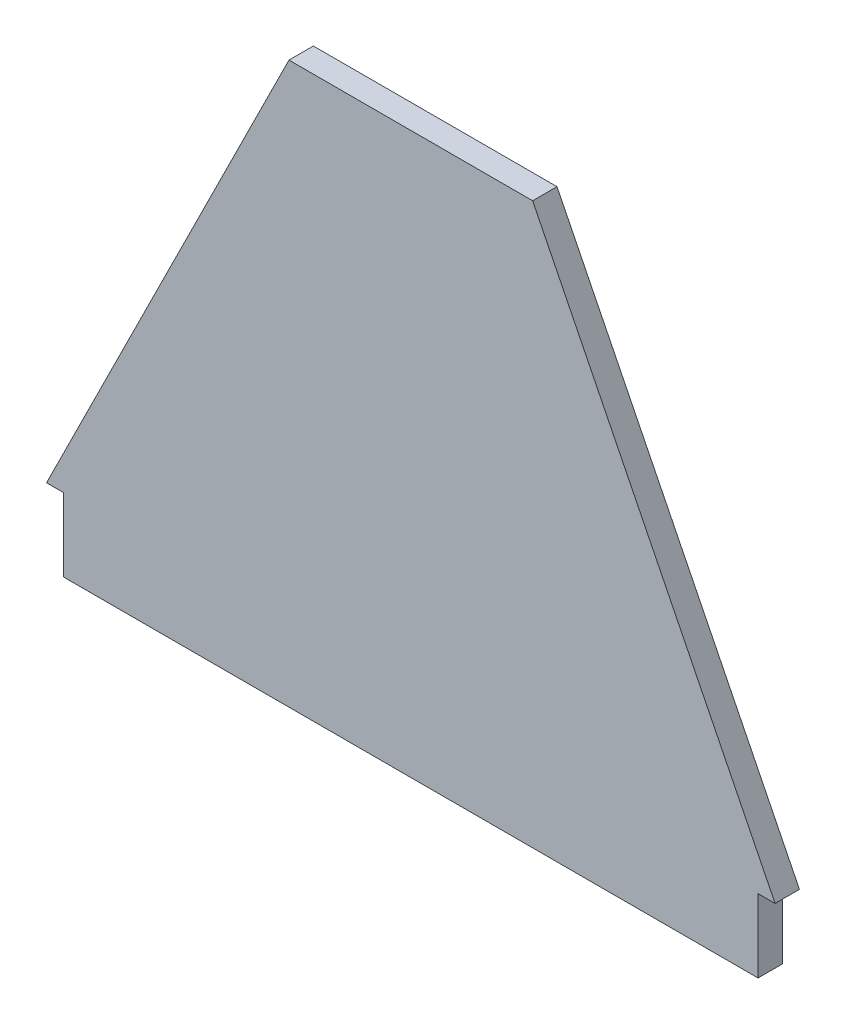
ISO-10303-21;
HEADER;
FILE_DESCRIPTION(('STEP AP214'),'2;1');
FILE_NAME('part.step','',(''),(''),'','','');
FILE_SCHEMA(('AUTOMOTIVE_DESIGN { 1 0 10303 214 1 1 1 1 }'));
ENDSEC;
DATA;
#1=APPLICATION_CONTEXT('core data for automotive mechanical design processes');
#2=APPLICATION_PROTOCOL_DEFINITION('international standard','automotive_design',2000,#1);
#3=PRODUCT_CONTEXT('',#1,'mechanical');
#4=PRODUCT('Part','Part','',(#3));
#5=PRODUCT_RELATED_PRODUCT_CATEGORY('part','',(#4));
#6=PRODUCT_DEFINITION_FORMATION('','',#4);
#7=PRODUCT_DEFINITION_CONTEXT('part definition',#1,'design');
#8=PRODUCT_DEFINITION('design','',#6,#7);
#9=PRODUCT_DEFINITION_SHAPE('','',#8);
#10=(LENGTH_UNIT() NAMED_UNIT(*) SI_UNIT(.MILLI.,.METRE.));
#11=(NAMED_UNIT(*) PLANE_ANGLE_UNIT() SI_UNIT($,.RADIAN.));
#12=(NAMED_UNIT(*) SI_UNIT($,.STERADIAN.) SOLID_ANGLE_UNIT());
#13=UNCERTAINTY_MEASURE_WITH_UNIT(LENGTH_MEASURE(1.E-05),#10,'distance_accuracy_value','');
#14=(GEOMETRIC_REPRESENTATION_CONTEXT(3) GLOBAL_UNCERTAINTY_ASSIGNED_CONTEXT((#13)) GLOBAL_UNIT_ASSIGNED_CONTEXT((#10,
#11,#12)) REPRESENTATION_CONTEXT('',''));
#15=CARTESIAN_POINT('',(0.,0.,0.));
#16=DIRECTION('',(0.,0.,1.));
#17=DIRECTION('',(1.,0.,0.));
#18=AXIS2_PLACEMENT_3D('',#15,#16,#17);
#19=CARTESIAN_POINT('',(-74.75,15.,5.));
#20=DIRECTION('',(0.895320719287127,-0.445422057845345,0.));
#21=DIRECTION('',(0.445422057845345,0.895320719287127,0.));
#22=AXIS2_PLACEMENT_3D('',#19,#20,#21);
#23=PLANE('',#22);
#24=DIRECTION('',(-0.445422057845345,-0.895320719287127,0.));
#25=VECTOR('',#24,1.);
#26=CARTESIAN_POINT('',(-74.75,15.,0.));
#27=LINE('',#26,#25);
#28=CARTESIAN_POINT('',(-25.,115.,0.));
#29=VERTEX_POINT('',#28);
#30=CARTESIAN_POINT('',(-74.75,15.,0.));
#31=VERTEX_POINT('',#30);
#32=EDGE_CURVE('E143',#29,#31,#27,.T.);
#33=ORIENTED_EDGE('',*,*,#32,.T.);
#34=DIRECTION('',(0.,0.,-1.));
#35=VECTOR('',#34,1.);
#36=CARTESIAN_POINT('',(-74.75,15.,5.));
#37=LINE('',#36,#35);
#38=CARTESIAN_POINT('',(-74.75,15.,5.));
#39=VERTEX_POINT('',#38);
#40=EDGE_CURVE('E11',#39,#31,#37,.T.);
#41=ORIENTED_EDGE('',*,*,#40,.F.);
#42=DIRECTION('',(-0.445422057845345,-0.895320719287127,0.));
#43=VECTOR('',#42,1.);
#44=CARTESIAN_POINT('',(-74.75,15.,5.));
#45=LINE('',#44,#43);
#46=CARTESIAN_POINT('',(-25.,115.,5.));
#47=VERTEX_POINT('',#46);
#48=EDGE_CURVE('E165',#47,#39,#45,.T.);
#49=ORIENTED_EDGE('',*,*,#48,.F.);
#50=DIRECTION('',(0.,0.,-1.));
#51=VECTOR('',#50,1.);
#52=CARTESIAN_POINT('',(-25.,115.,5.));
#53=LINE('',#52,#51);
#54=EDGE_CURVE('E139',#47,#29,#53,.T.);
#55=ORIENTED_EDGE('',*,*,#54,.T.);
#56=EDGE_LOOP('',(#33,#41,#49,#55));
#57=FACE_BOUND('',#56,.T.);
#58=ADVANCED_FACE('F41',(#57),#23,.F.);
#59=CARTESIAN_POINT('',(-71.25,15.,5.));
#60=DIRECTION('',(0.,1.,0.));
#61=DIRECTION('',(-1.,0.,0.));
#62=AXIS2_PLACEMENT_3D('',#59,#60,#61);
#63=PLANE('',#62);
#64=DIRECTION('',(1.,0.,0.));
#65=VECTOR('',#64,1.);
#66=CARTESIAN_POINT('',(-71.25,15.,0.));
#67=LINE('',#66,#65);
#68=CARTESIAN_POINT('',(-71.25,15.,0.));
#69=VERTEX_POINT('',#68);
#70=EDGE_CURVE('E147',#31,#69,#67,.T.);
#71=ORIENTED_EDGE('',*,*,#70,.T.);
#72=DIRECTION('',(0.,0.,-1.));
#73=VECTOR('',#72,1.);
#74=CARTESIAN_POINT('',(-71.25,15.,5.));
#75=LINE('',#74,#73);
#76=CARTESIAN_POINT('',(-71.25,15.,5.));
#77=VERTEX_POINT('',#76);
#78=EDGE_CURVE('E50',#77,#69,#75,.T.);
#79=ORIENTED_EDGE('',*,*,#78,.F.);
#80=DIRECTION('',(1.,0.,0.));
#81=VECTOR('',#80,1.);
#82=CARTESIAN_POINT('',(-71.25,15.,5.));
#83=LINE('',#82,#81);
#84=EDGE_CURVE('E101',#39,#77,#83,.T.);
#85=ORIENTED_EDGE('',*,*,#84,.F.);
#86=ORIENTED_EDGE('',*,*,#40,.T.);
#87=EDGE_LOOP('',(#71,#79,#85,#86));
#88=FACE_BOUND('',#87,.T.);
#89=ADVANCED_FACE('F214',(#88),#63,.F.);
#90=CARTESIAN_POINT('',(-71.25,0.,5.));
#91=DIRECTION('',(1.,0.,0.));
#92=DIRECTION('',(0.,0.,-1.));
#93=AXIS2_PLACEMENT_3D('',#90,#91,#92);
#94=PLANE('',#93);
#95=DIRECTION('',(0.,-1.,0.));
#96=VECTOR('',#95,1.);
#97=CARTESIAN_POINT('',(-71.25,0.,0.));
#98=LINE('',#97,#96);
#99=CARTESIAN_POINT('',(-71.25,0.,0.));
#100=VERTEX_POINT('',#99);
#101=EDGE_CURVE('E150',#69,#100,#98,.T.);
#102=ORIENTED_EDGE('',*,*,#101,.T.);
#103=DIRECTION('',(0.,0.,-1.));
#104=VECTOR('',#103,1.);
#105=CARTESIAN_POINT('',(-71.25,0.,5.));
#106=LINE('',#105,#104);
#107=CARTESIAN_POINT('',(-71.25,0.,5.));
#108=VERTEX_POINT('',#107);
#109=EDGE_CURVE('E176',#108,#100,#106,.T.);
#110=ORIENTED_EDGE('',*,*,#109,.F.);
#111=DIRECTION('',(0.,-1.,0.));
#112=VECTOR('',#111,1.);
#113=CARTESIAN_POINT('',(-71.25,0.,5.));
#114=LINE('',#113,#112);
#115=EDGE_CURVE('E187',#77,#108,#114,.T.);
#116=ORIENTED_EDGE('',*,*,#115,.F.);
#117=ORIENTED_EDGE('',*,*,#78,.T.);
#118=EDGE_LOOP('',(#102,#110,#116,#117));
#119=FACE_BOUND('',#118,.T.);
#120=ADVANCED_FACE('F185',(#119),#94,.F.);
#121=CARTESIAN_POINT('',(71.25,0.,5.));
#122=DIRECTION('',(0.,1.,0.));
#123=DIRECTION('',(0.,0.,1.));
#124=AXIS2_PLACEMENT_3D('',#121,#122,#123);
#125=PLANE('',#124);
#126=DIRECTION('',(1.,0.,0.));
#127=VECTOR('',#126,1.);
#128=CARTESIAN_POINT('',(71.25,0.,0.));
#129=LINE('',#128,#127);
#130=CARTESIAN_POINT('',(71.25,0.,0.));
#131=VERTEX_POINT('',#130);
#132=EDGE_CURVE('E153',#100,#131,#129,.T.);
#133=ORIENTED_EDGE('',*,*,#132,.T.);
#134=DIRECTION('',(0.,0.,-1.));
#135=VECTOR('',#134,1.);
#136=CARTESIAN_POINT('',(71.25,0.,5.));
#137=LINE('',#136,#135);
#138=CARTESIAN_POINT('',(71.25,0.,5.));
#139=VERTEX_POINT('',#138);
#140=EDGE_CURVE('E172',#139,#131,#137,.T.);
#141=ORIENTED_EDGE('',*,*,#140,.F.);
#142=DIRECTION('',(1.,0.,0.));
#143=VECTOR('',#142,1.);
#144=CARTESIAN_POINT('',(71.25,0.,5.));
#145=LINE('',#144,#143);
#146=EDGE_CURVE('E200',#108,#139,#145,.T.);
#147=ORIENTED_EDGE('',*,*,#146,.F.);
#148=ORIENTED_EDGE('',*,*,#109,.T.);
#149=EDGE_LOOP('',(#133,#141,#147,#148));
#150=FACE_BOUND('',#149,.T.);
#151=ADVANCED_FACE('F195',(#150),#125,.F.);
#152=CARTESIAN_POINT('',(71.25,15.,5.));
#153=DIRECTION('',(-1.,0.,0.));
#154=DIRECTION('',(0.,0.,1.));
#155=AXIS2_PLACEMENT_3D('',#152,#153,#154);
#156=PLANE('',#155);
#157=DIRECTION('',(0.,1.,0.));
#158=VECTOR('',#157,1.);
#159=CARTESIAN_POINT('',(71.25,15.,0.));
#160=LINE('',#159,#158);
#161=CARTESIAN_POINT('',(71.25,15.,0.));
#162=VERTEX_POINT('',#161);
#163=EDGE_CURVE('E156',#131,#162,#160,.T.);
#164=ORIENTED_EDGE('',*,*,#163,.T.);
#165=DIRECTION('',(0.,0.,-1.));
#166=VECTOR('',#165,1.);
#167=CARTESIAN_POINT('',(71.25,15.,5.));
#168=LINE('',#167,#166);
#169=CARTESIAN_POINT('',(71.25,15.,5.));
#170=VERTEX_POINT('',#169);
#171=EDGE_CURVE('E131',#170,#162,#168,.T.);
#172=ORIENTED_EDGE('',*,*,#171,.F.);
#173=DIRECTION('',(0.,1.,0.));
#174=VECTOR('',#173,1.);
#175=CARTESIAN_POINT('',(71.25,15.,5.));
#176=LINE('',#175,#174);
#177=EDGE_CURVE('E120',#139,#170,#176,.T.);
#178=ORIENTED_EDGE('',*,*,#177,.F.);
#179=ORIENTED_EDGE('',*,*,#140,.T.);
#180=EDGE_LOOP('',(#164,#172,#178,#179));
#181=FACE_BOUND('',#180,.T.);
#182=ADVANCED_FACE('F198',(#181),#156,.F.);
#183=CARTESIAN_POINT('',(74.75,15.,5.));
#184=DIRECTION('',(0.,1.,0.));
#185=DIRECTION('',(-1.,0.,0.));
#186=AXIS2_PLACEMENT_3D('',#183,#184,#185);
#187=PLANE('',#186);
#188=DIRECTION('',(1.,0.,0.));
#189=VECTOR('',#188,1.);
#190=CARTESIAN_POINT('',(74.75,15.,0.));
#191=LINE('',#190,#189);
#192=CARTESIAN_POINT('',(74.75,15.,0.));
#193=VERTEX_POINT('',#192);
#194=EDGE_CURVE('E129',#162,#193,#191,.T.);
#195=ORIENTED_EDGE('',*,*,#194,.T.);
#196=DIRECTION('',(0.,0.,-1.));
#197=VECTOR('',#196,1.);
#198=CARTESIAN_POINT('',(74.75,15.,5.));
#199=LINE('',#198,#197);
#200=CARTESIAN_POINT('',(74.75,15.,5.));
#201=VERTEX_POINT('',#200);
#202=EDGE_CURVE('E126',#201,#193,#199,.T.);
#203=ORIENTED_EDGE('',*,*,#202,.F.);
#204=DIRECTION('',(1.,0.,0.));
#205=VECTOR('',#204,1.);
#206=CARTESIAN_POINT('',(74.75,15.,5.));
#207=LINE('',#206,#205);
#208=EDGE_CURVE('E114',#170,#201,#207,.T.);
#209=ORIENTED_EDGE('',*,*,#208,.F.);
#210=ORIENTED_EDGE('',*,*,#171,.T.);
#211=EDGE_LOOP('',(#195,#203,#209,#210));
#212=FACE_BOUND('',#211,.T.);
#213=ADVANCED_FACE('F127',(#212),#187,.F.);
#214=CARTESIAN_POINT('',(74.75,15.,5.));
#215=DIRECTION('',(-0.895320719287127,-0.445422057845345,0.));
#216=DIRECTION('',(0.445422057845345,-0.895320719287127,0.));
#217=AXIS2_PLACEMENT_3D('',#214,#215,#216);
#218=PLANE('',#217);
#219=DIRECTION('',(-0.445422057845345,0.895320719287127,0.));
#220=VECTOR('',#219,1.);
#221=CARTESIAN_POINT('',(74.75,15.,0.));
#222=LINE('',#221,#220);
#223=CARTESIAN_POINT('',(25.,115.,0.));
#224=VERTEX_POINT('',#223);
#225=EDGE_CURVE('E87',#193,#224,#222,.T.);
#226=ORIENTED_EDGE('',*,*,#225,.T.);
#227=DIRECTION('',(0.,0.,-1.));
#228=VECTOR('',#227,1.);
#229=CARTESIAN_POINT('',(25.,115.,5.));
#230=LINE('',#229,#228);
#231=CARTESIAN_POINT('',(25.,115.,5.));
#232=VERTEX_POINT('',#231);
#233=EDGE_CURVE('E132',#232,#224,#230,.T.);
#234=ORIENTED_EDGE('',*,*,#233,.F.);
#235=DIRECTION('',(-0.445422057845345,0.895320719287127,0.));
#236=VECTOR('',#235,1.);
#237=CARTESIAN_POINT('',(74.75,15.,5.));
#238=LINE('',#237,#236);
#239=EDGE_CURVE('E118',#201,#232,#238,.T.);
#240=ORIENTED_EDGE('',*,*,#239,.F.);
#241=ORIENTED_EDGE('',*,*,#202,.T.);
#242=EDGE_LOOP('',(#226,#234,#240,#241));
#243=FACE_BOUND('',#242,.T.);
#244=ADVANCED_FACE('F134',(#243),#218,.F.);
#245=CARTESIAN_POINT('',(-25.,115.,5.));
#246=DIRECTION('',(0.,-1.,0.));
#247=DIRECTION('',(1.,0.,0.));
#248=AXIS2_PLACEMENT_3D('',#245,#246,#247);
#249=PLANE('',#248);
#250=DIRECTION('',(-1.,0.,0.));
#251=VECTOR('',#250,1.);
#252=CARTESIAN_POINT('',(-25.,115.,0.));
#253=LINE('',#252,#251);
#254=EDGE_CURVE('E93',#224,#29,#253,.T.);
#255=ORIENTED_EDGE('',*,*,#254,.T.);
#256=ORIENTED_EDGE('',*,*,#54,.F.);
#257=DIRECTION('',(-1.,0.,0.));
#258=VECTOR('',#257,1.);
#259=CARTESIAN_POINT('',(-25.,115.,5.));
#260=LINE('',#259,#258);
#261=EDGE_CURVE('E58',#232,#47,#260,.T.);
#262=ORIENTED_EDGE('',*,*,#261,.F.);
#263=ORIENTED_EDGE('',*,*,#233,.T.);
#264=EDGE_LOOP('',(#255,#256,#262,#263));
#265=FACE_BOUND('',#264,.T.);
#266=ADVANCED_FACE('F230',(#265),#249,.F.);
#267=CARTESIAN_POINT('',(0.,0.,5.));
#268=DIRECTION('',(0.,0.,-1.));
#269=DIRECTION('',(-1.,0.,0.));
#270=AXIS2_PLACEMENT_3D('',#267,#268,#269);
#271=PLANE('',#270);
#272=ORIENTED_EDGE('',*,*,#48,.T.);
#273=ORIENTED_EDGE('',*,*,#84,.T.);
#274=ORIENTED_EDGE('',*,*,#115,.T.);
#275=ORIENTED_EDGE('',*,*,#146,.T.);
#276=ORIENTED_EDGE('',*,*,#177,.T.);
#277=ORIENTED_EDGE('',*,*,#208,.T.);
#278=ORIENTED_EDGE('',*,*,#239,.T.);
#279=ORIENTED_EDGE('',*,*,#261,.T.);
#280=EDGE_LOOP('',(#272,#273,#274,#275,#276,#277,#278,#279));
#281=FACE_BOUND('',#280,.T.);
#282=ADVANCED_FACE('F116',(#281),#271,.F.);
#283=CARTESIAN_POINT('',(0.,0.,0.));
#284=DIRECTION('',(0.,0.,-1.));
#285=DIRECTION('',(-1.,0.,0.));
#286=AXIS2_PLACEMENT_3D('',#283,#284,#285);
#287=PLANE('',#286);
#288=ORIENTED_EDGE('',*,*,#32,.F.);
#289=ORIENTED_EDGE('',*,*,#254,.F.);
#290=ORIENTED_EDGE('',*,*,#225,.F.);
#291=ORIENTED_EDGE('',*,*,#194,.F.);
#292=ORIENTED_EDGE('',*,*,#163,.F.);
#293=ORIENTED_EDGE('',*,*,#132,.F.);
#294=ORIENTED_EDGE('',*,*,#101,.F.);
#295=ORIENTED_EDGE('',*,*,#70,.F.);
#296=EDGE_LOOP('',(#288,#289,#290,#291,#292,#293,#294,#295));
#297=FACE_BOUND('',#296,.T.);
#298=ADVANCED_FACE('F191',(#297),#287,.T.);
#299=CLOSED_SHELL('',(#58,#89,#120,#151,#182,#213,#244,#266,#282,#298));
#300=MANIFOLD_SOLID_BREP('B2',#299);
#301=ADVANCED_BREP_SHAPE_REPRESENTATION('',(#18,#300),#14);
#302=SHAPE_DEFINITION_REPRESENTATION(#9,#301);
ENDSEC;
END-ISO-10303-21;
